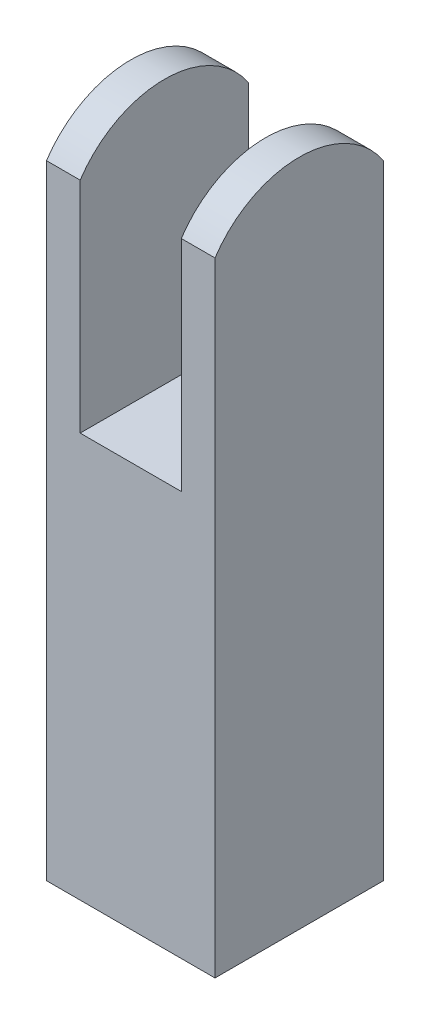
ISO-10303-21;
HEADER;
FILE_DESCRIPTION(('STEP AP214'),'2;1');
FILE_NAME('part.step','',(''),(''),'','','');
FILE_SCHEMA(('AUTOMOTIVE_DESIGN { 1 0 10303 214 1 1 1 1 }'));
ENDSEC;
DATA;
#1=APPLICATION_CONTEXT('core data for automotive mechanical design processes');
#2=APPLICATION_PROTOCOL_DEFINITION('international standard','automotive_design',2000,#1);
#3=PRODUCT_CONTEXT('',#1,'mechanical');
#4=PRODUCT('Part','Part','',(#3));
#5=PRODUCT_RELATED_PRODUCT_CATEGORY('part','',(#4));
#6=PRODUCT_DEFINITION_FORMATION('','',#4);
#7=PRODUCT_DEFINITION_CONTEXT('part definition',#1,'design');
#8=PRODUCT_DEFINITION('design','',#6,#7);
#9=PRODUCT_DEFINITION_SHAPE('','',#8);
#10=(LENGTH_UNIT() NAMED_UNIT(*) SI_UNIT(.MILLI.,.METRE.));
#11=(NAMED_UNIT(*) PLANE_ANGLE_UNIT() SI_UNIT($,.RADIAN.));
#12=(NAMED_UNIT(*) SI_UNIT($,.STERADIAN.) SOLID_ANGLE_UNIT());
#13=UNCERTAINTY_MEASURE_WITH_UNIT(LENGTH_MEASURE(1.E-05),#10,'distance_accuracy_value','');
#14=(GEOMETRIC_REPRESENTATION_CONTEXT(3) GLOBAL_UNCERTAINTY_ASSIGNED_CONTEXT((#13)) GLOBAL_UNIT_ASSIGNED_CONTEXT((#10,
#11,#12)) REPRESENTATION_CONTEXT('',''));
#15=CARTESIAN_POINT('',(0.,0.,0.));
#16=DIRECTION('',(0.,0.,1.));
#17=DIRECTION('',(1.,0.,0.));
#18=AXIS2_PLACEMENT_3D('',#15,#16,#17);
#19=CARTESIAN_POINT('',(0.,200.,0.));
#20=DIRECTION('',(-1.,0.,0.));
#21=DIRECTION('',(0.,0.,1.));
#22=AXIS2_PLACEMENT_3D('',#19,#20,#21);
#23=PLANE('',#22);
#24=CARTESIAN_POINT('',(0.,168.416876048223,-25.));
#25=DIRECTION('',(-1.,0.,0.));
#26=DIRECTION('',(0.,0.,1.));
#27=AXIS2_PLACEMENT_3D('',#24,#25,#26);
#28=CIRCLE('',#27,30.);
#29=CARTESIAN_POINT('',(0.,185.,0.));
#30=VERTEX_POINT('',#29);
#31=CARTESIAN_POINT('',(0.,185.,-50.));
#32=VERTEX_POINT('',#31);
#33=EDGE_CURVE('E123',#30,#32,#28,.T.);
#34=ORIENTED_EDGE('',*,*,#33,.F.);
#35=DIRECTION('',(0.,-1.,0.));
#36=VECTOR('',#35,1.);
#37=CARTESIAN_POINT('',(0.,200.,0.));
#38=LINE('',#37,#36);
#39=CARTESIAN_POINT('',(0.,0.,0.));
#40=VERTEX_POINT('',#39);
#41=EDGE_CURVE('E116',#30,#40,#38,.T.);
#42=ORIENTED_EDGE('',*,*,#41,.T.);
#43=DIRECTION('',(0.,0.,-1.));
#44=VECTOR('',#43,1.);
#45=CARTESIAN_POINT('',(0.,0.,0.));
#46=LINE('',#45,#44);
#47=CARTESIAN_POINT('',(0.,0.,-50.));
#48=VERTEX_POINT('',#47);
#49=EDGE_CURVE('E143',#40,#48,#46,.T.);
#50=ORIENTED_EDGE('',*,*,#49,.T.);
#51=DIRECTION('',(0.,-1.,0.));
#52=VECTOR('',#51,1.);
#53=CARTESIAN_POINT('',(0.,200.,-50.));
#54=LINE('',#53,#52);
#55=EDGE_CURVE('E42',#32,#48,#54,.T.);
#56=ORIENTED_EDGE('',*,*,#55,.F.);
#57=EDGE_LOOP('',(#34,#42,#50,#56));
#58=FACE_BOUND('',#57,.T.);
#59=ADVANCED_FACE('F35',(#58),#23,.F.);
#60=CARTESIAN_POINT('',(0.,200.,-50.));
#61=DIRECTION('',(0.,0.,1.));
#62=DIRECTION('',(1.,0.,0.));
#63=AXIS2_PLACEMENT_3D('',#60,#61,#62);
#64=PLANE('',#63);
#65=DIRECTION('',(-1.,0.,0.));
#66=VECTOR('',#65,1.);
#67=CARTESIAN_POINT('',(315.165042944955,185.,-50.));
#68=LINE('',#67,#66);
#69=CARTESIAN_POINT('',(-10.,185.,-50.));
#70=VERTEX_POINT('',#69);
#71=EDGE_CURVE('E49',#32,#70,#68,.T.);
#72=ORIENTED_EDGE('',*,*,#71,.F.);
#73=ORIENTED_EDGE('',*,*,#55,.T.);
#74=DIRECTION('',(-1.,0.,0.));
#75=VECTOR('',#74,1.);
#76=CARTESIAN_POINT('',(0.,0.,-50.));
#77=LINE('',#76,#75);
#78=CARTESIAN_POINT('',(-50.,0.,-50.));
#79=VERTEX_POINT('',#78);
#80=EDGE_CURVE('E149',#48,#79,#77,.T.);
#81=ORIENTED_EDGE('',*,*,#80,.T.);
#82=DIRECTION('',(0.,-1.,0.));
#83=VECTOR('',#82,1.);
#84=CARTESIAN_POINT('',(-50.,200.,-50.));
#85=LINE('',#84,#83);
#86=CARTESIAN_POINT('',(-49.9999999999999,185.,-50.));
#87=VERTEX_POINT('',#86);
#88=EDGE_CURVE('E160',#87,#79,#85,.T.);
#89=ORIENTED_EDGE('',*,*,#88,.F.);
#90=CARTESIAN_POINT('',(-39.9999999999999,185.,-50.));
#91=VERTEX_POINT('',#90);
#92=EDGE_CURVE('E119',#91,#87,#68,.T.);
#93=ORIENTED_EDGE('',*,*,#92,.F.);
#94=DIRECTION('',(0.,1.,0.));
#95=VECTOR('',#94,1.);
#96=CARTESIAN_POINT('',(-40.,120.,-50.));
#97=LINE('',#96,#95);
#98=CARTESIAN_POINT('',(-40.,120.,-50.));
#99=VERTEX_POINT('',#98);
#100=EDGE_CURVE('E141',#99,#91,#97,.T.);
#101=ORIENTED_EDGE('',*,*,#100,.F.);
#102=DIRECTION('',(-1.,0.,0.));
#103=VECTOR('',#102,1.);
#104=CARTESIAN_POINT('',(-40.,120.,-50.));
#105=LINE('',#104,#103);
#106=CARTESIAN_POINT('',(-10.,120.,-50.));
#107=VERTEX_POINT('',#106);
#108=EDGE_CURVE('E138',#107,#99,#105,.T.);
#109=ORIENTED_EDGE('',*,*,#108,.F.);
#110=DIRECTION('',(0.,1.,0.));
#111=VECTOR('',#110,1.);
#112=CARTESIAN_POINT('',(-10.,120.,-50.));
#113=LINE('',#112,#111);
#114=EDGE_CURVE('E108',#107,#70,#113,.T.);
#115=ORIENTED_EDGE('',*,*,#114,.T.);
#116=EDGE_LOOP('',(#72,#73,#81,#89,#93,#101,#109,#115));
#117=FACE_BOUND('',#116,.T.);
#118=ADVANCED_FACE('F162',(#117),#64,.F.);
#119=CARTESIAN_POINT('',(-50.,200.,0.));
#120=DIRECTION('',(1.,0.,0.));
#121=DIRECTION('',(0.,0.,-1.));
#122=AXIS2_PLACEMENT_3D('',#119,#120,#121);
#123=PLANE('',#122);
#124=CARTESIAN_POINT('',(-49.9999999999999,168.416876048223,-25.));
#125=DIRECTION('',(1.,0.,0.));
#126=DIRECTION('',(0.,0.,-1.));
#127=AXIS2_PLACEMENT_3D('',#124,#125,#126);
#128=CIRCLE('',#127,30.);
#129=CARTESIAN_POINT('',(-50.,185.,0.));
#130=VERTEX_POINT('',#129);
#131=EDGE_CURVE('E57',#87,#130,#128,.T.);
#132=ORIENTED_EDGE('',*,*,#131,.F.);
#133=ORIENTED_EDGE('',*,*,#88,.T.);
#134=DIRECTION('',(0.,0.,1.));
#135=VECTOR('',#134,1.);
#136=CARTESIAN_POINT('',(-50.,0.,0.));
#137=LINE('',#136,#135);
#138=CARTESIAN_POINT('',(-50.,0.,0.));
#139=VERTEX_POINT('',#138);
#140=EDGE_CURVE('E152',#79,#139,#137,.T.);
#141=ORIENTED_EDGE('',*,*,#140,.T.);
#142=DIRECTION('',(0.,-1.,0.));
#143=VECTOR('',#142,1.);
#144=CARTESIAN_POINT('',(-50.,200.,0.));
#145=LINE('',#144,#143);
#146=EDGE_CURVE('E158',#130,#139,#145,.T.);
#147=ORIENTED_EDGE('',*,*,#146,.F.);
#148=EDGE_LOOP('',(#132,#133,#141,#147));
#149=FACE_BOUND('',#148,.T.);
#150=ADVANCED_FACE('F170',(#149),#123,.F.);
#151=CARTESIAN_POINT('',(0.,200.,0.));
#152=DIRECTION('',(0.,0.,-1.));
#153=DIRECTION('',(-1.,0.,0.));
#154=AXIS2_PLACEMENT_3D('',#151,#152,#153);
#155=PLANE('',#154);
#156=DIRECTION('',(-1.,0.,0.));
#157=VECTOR('',#156,1.);
#158=CARTESIAN_POINT('',(315.165042944955,185.,0.));
#159=LINE('',#158,#157);
#160=CARTESIAN_POINT('',(-40.,185.,0.));
#161=VERTEX_POINT('',#160);
#162=EDGE_CURVE('E120',#161,#130,#159,.T.);
#163=ORIENTED_EDGE('',*,*,#162,.T.);
#164=ORIENTED_EDGE('',*,*,#146,.T.);
#165=DIRECTION('',(1.,0.,0.));
#166=VECTOR('',#165,1.);
#167=CARTESIAN_POINT('',(0.,0.,0.));
#168=LINE('',#167,#166);
#169=EDGE_CURVE('E155',#139,#40,#168,.T.);
#170=ORIENTED_EDGE('',*,*,#169,.T.);
#171=ORIENTED_EDGE('',*,*,#41,.F.);
#172=CARTESIAN_POINT('',(-9.9999999999999,185.,0.));
#173=VERTEX_POINT('',#172);
#174=EDGE_CURVE('E113',#30,#173,#159,.T.);
#175=ORIENTED_EDGE('',*,*,#174,.T.);
#176=DIRECTION('',(0.,1.,0.));
#177=VECTOR('',#176,1.);
#178=CARTESIAN_POINT('',(-10.,120.,0.));
#179=LINE('',#178,#177);
#180=CARTESIAN_POINT('',(-10.,120.,0.));
#181=VERTEX_POINT('',#180);
#182=EDGE_CURVE('E100',#181,#173,#179,.T.);
#183=ORIENTED_EDGE('',*,*,#182,.F.);
#184=DIRECTION('',(1.,0.,0.));
#185=VECTOR('',#184,1.);
#186=CARTESIAN_POINT('',(-40.,120.,0.));
#187=LINE('',#186,#185);
#188=CARTESIAN_POINT('',(-40.,120.,0.));
#189=VERTEX_POINT('',#188);
#190=EDGE_CURVE('E135',#189,#181,#187,.T.);
#191=ORIENTED_EDGE('',*,*,#190,.F.);
#192=DIRECTION('',(0.,1.,0.));
#193=VECTOR('',#192,1.);
#194=CARTESIAN_POINT('',(-40.,120.,0.));
#195=LINE('',#194,#193);
#196=EDGE_CURVE('E109',#189,#161,#195,.T.);
#197=ORIENTED_EDGE('',*,*,#196,.T.);
#198=EDGE_LOOP('',(#163,#164,#170,#171,#175,#183,#191,#197));
#199=FACE_BOUND('',#198,.T.);
#200=ADVANCED_FACE('F114',(#199),#155,.F.);
#201=CARTESIAN_POINT('',(-40.,120.,0.));
#202=DIRECTION('',(-1.,0.,0.));
#203=DIRECTION('',(0.,0.,1.));
#204=AXIS2_PLACEMENT_3D('',#201,#202,#203);
#205=PLANE('',#204);
#206=CARTESIAN_POINT('',(-40.,168.416876048223,-25.));
#207=DIRECTION('',(-1.,0.,0.));
#208=DIRECTION('',(0.,0.,1.));
#209=AXIS2_PLACEMENT_3D('',#206,#207,#208);
#210=CIRCLE('',#209,30.);
#211=EDGE_CURVE('E124',#161,#91,#210,.T.);
#212=ORIENTED_EDGE('',*,*,#211,.F.);
#213=ORIENTED_EDGE('',*,*,#196,.F.);
#214=DIRECTION('',(0.,0.,1.));
#215=VECTOR('',#214,1.);
#216=CARTESIAN_POINT('',(-40.,120.,0.));
#217=LINE('',#216,#215);
#218=EDGE_CURVE('E132',#99,#189,#217,.T.);
#219=ORIENTED_EDGE('',*,*,#218,.F.);
#220=ORIENTED_EDGE('',*,*,#100,.T.);
#221=EDGE_LOOP('',(#212,#213,#219,#220));
#222=FACE_BOUND('',#221,.T.);
#223=ADVANCED_FACE('F176',(#222),#205,.F.);
#224=CARTESIAN_POINT('',(-10.,120.,0.));
#225=DIRECTION('',(1.,0.,0.));
#226=DIRECTION('',(0.,0.,-1.));
#227=AXIS2_PLACEMENT_3D('',#224,#225,#226);
#228=PLANE('',#227);
#229=CARTESIAN_POINT('',(-10.,168.416876048223,-25.));
#230=DIRECTION('',(1.,0.,0.));
#231=DIRECTION('',(0.,0.,-1.));
#232=AXIS2_PLACEMENT_3D('',#229,#230,#231);
#233=CIRCLE('',#232,30.);
#234=EDGE_CURVE('E11',#70,#173,#233,.T.);
#235=ORIENTED_EDGE('',*,*,#234,.F.);
#236=ORIENTED_EDGE('',*,*,#114,.F.);
#237=DIRECTION('',(0.,0.,-1.));
#238=VECTOR('',#237,1.);
#239=CARTESIAN_POINT('',(-10.,120.,0.));
#240=LINE('',#239,#238);
#241=EDGE_CURVE('E104',#181,#107,#240,.T.);
#242=ORIENTED_EDGE('',*,*,#241,.F.);
#243=ORIENTED_EDGE('',*,*,#182,.T.);
#244=EDGE_LOOP('',(#235,#236,#242,#243));
#245=FACE_BOUND('',#244,.T.);
#246=ADVANCED_FACE('F102',(#245),#228,.F.);
#247=CARTESIAN_POINT('',(0.,0.,0.));
#248=DIRECTION('',(0.,1.,0.));
#249=DIRECTION('',(0.,0.,1.));
#250=AXIS2_PLACEMENT_3D('',#247,#248,#249);
#251=PLANE('',#250);
#252=ORIENTED_EDGE('',*,*,#49,.F.);
#253=ORIENTED_EDGE('',*,*,#169,.F.);
#254=ORIENTED_EDGE('',*,*,#140,.F.);
#255=ORIENTED_EDGE('',*,*,#80,.F.);
#256=EDGE_LOOP('',(#252,#253,#254,#255));
#257=FACE_BOUND('',#256,.T.);
#258=ADVANCED_FACE('F167',(#257),#251,.F.);
#259=CARTESIAN_POINT('',(0.,120.,0.));
#260=DIRECTION('',(0.,-1.,0.));
#261=DIRECTION('',(0.,0.,-1.));
#262=AXIS2_PLACEMENT_3D('',#259,#260,#261);
#263=PLANE('',#262);
#264=ORIENTED_EDGE('',*,*,#218,.T.);
#265=ORIENTED_EDGE('',*,*,#190,.T.);
#266=ORIENTED_EDGE('',*,*,#241,.T.);
#267=ORIENTED_EDGE('',*,*,#108,.T.);
#268=EDGE_LOOP('',(#264,#265,#266,#267));
#269=FACE_BOUND('',#268,.T.);
#270=ADVANCED_FACE('F178',(#269),#263,.F.);
#271=CARTESIAN_POINT('',(315.165042944955,168.416876048223,-25.));
#272=DIRECTION('',(-1.,0.,0.));
#273=DIRECTION('',(0.,0.,1.));
#274=AXIS2_PLACEMENT_3D('',#271,#272,#273);
#275=CYLINDRICAL_SURFACE('',#274,30.);
#276=ORIENTED_EDGE('',*,*,#174,.F.);
#277=ORIENTED_EDGE('',*,*,#33,.T.);
#278=ORIENTED_EDGE('',*,*,#71,.T.);
#279=ORIENTED_EDGE('',*,*,#234,.T.);
#280=EDGE_LOOP('',(#276,#277,#278,#279));
#281=FACE_BOUND('',#280,.T.);
#282=ADVANCED_FACE('F122',(#281),#275,.T.);
#283=ORIENTED_EDGE('',*,*,#92,.T.);
#284=ORIENTED_EDGE('',*,*,#131,.T.);
#285=ORIENTED_EDGE('',*,*,#162,.F.);
#286=ORIENTED_EDGE('',*,*,#211,.T.);
#287=EDGE_LOOP('',(#283,#284,#285,#286));
#288=FACE_BOUND('',#287,.T.);
#289=ADVANCED_FACE('F174',(#288),#275,.T.);
#290=CLOSED_SHELL('',(#59,#118,#150,#200,#223,#246,#258,#270,#282,#289));
#291=MANIFOLD_SOLID_BREP('B2',#290);
#292=ADVANCED_BREP_SHAPE_REPRESENTATION('',(#18,#291),#14);
#293=SHAPE_DEFINITION_REPRESENTATION(#9,#292);
ENDSEC;
END-ISO-10303-21;
